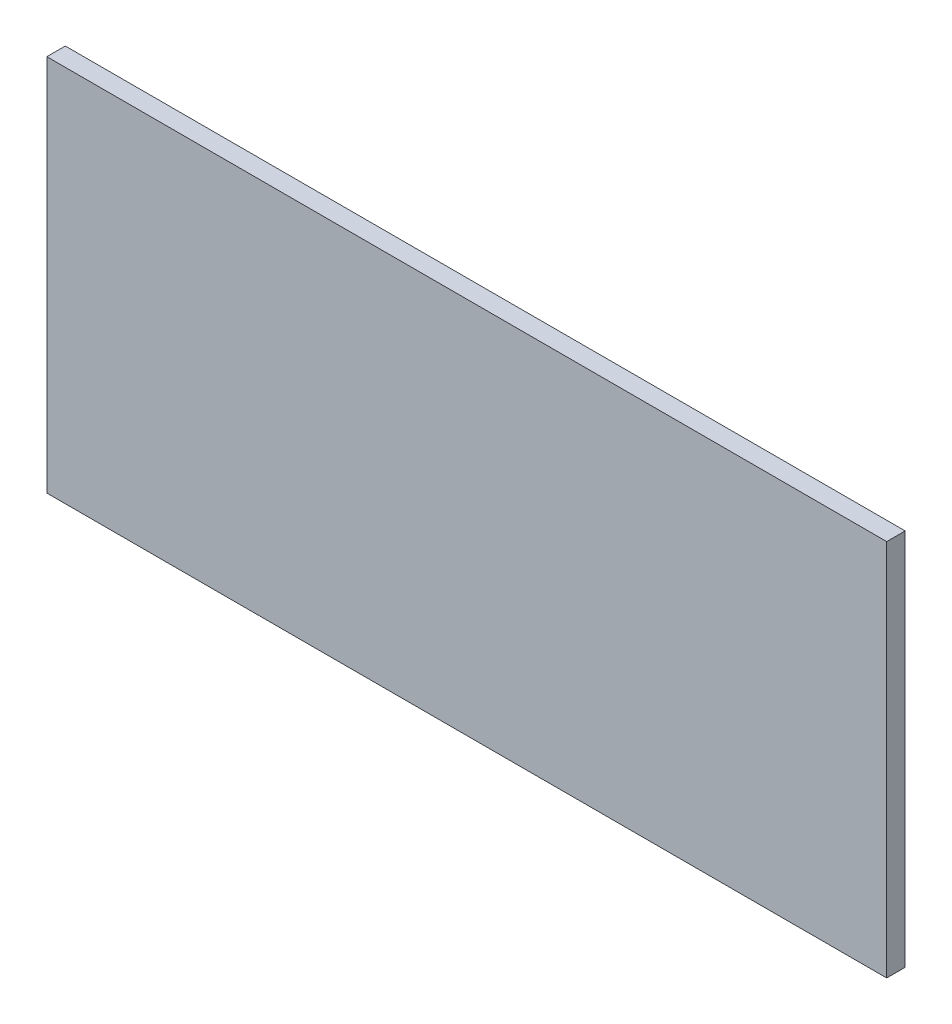
ISO-10303-21;
HEADER;
FILE_DESCRIPTION(('STEP AP214'),'2;1');
FILE_NAME('part.step','',(''),(''),'','','');
FILE_SCHEMA(('AUTOMOTIVE_DESIGN { 1 0 10303 214 1 1 1 1 }'));
ENDSEC;
DATA;
#1=APPLICATION_CONTEXT('core data for automotive mechanical design processes');
#2=APPLICATION_PROTOCOL_DEFINITION('international standard','automotive_design',2000,#1);
#3=PRODUCT_CONTEXT('',#1,'mechanical');
#4=PRODUCT('Part','Part','',(#3));
#5=PRODUCT_RELATED_PRODUCT_CATEGORY('part','',(#4));
#6=PRODUCT_DEFINITION_FORMATION('','',#4);
#7=PRODUCT_DEFINITION_CONTEXT('part definition',#1,'design');
#8=PRODUCT_DEFINITION('design','',#6,#7);
#9=PRODUCT_DEFINITION_SHAPE('','',#8);
#10=(LENGTH_UNIT() NAMED_UNIT(*) SI_UNIT(.MILLI.,.METRE.));
#11=(NAMED_UNIT(*) PLANE_ANGLE_UNIT() SI_UNIT($,.RADIAN.));
#12=(NAMED_UNIT(*) SI_UNIT($,.STERADIAN.) SOLID_ANGLE_UNIT());
#13=UNCERTAINTY_MEASURE_WITH_UNIT(LENGTH_MEASURE(1.E-05),#10,'distance_accuracy_value','');
#14=(GEOMETRIC_REPRESENTATION_CONTEXT(3) GLOBAL_UNCERTAINTY_ASSIGNED_CONTEXT((#13)) GLOBAL_UNIT_ASSIGNED_CONTEXT((#10,
#11,#12)) REPRESENTATION_CONTEXT('',''));
#15=CARTESIAN_POINT('',(0.,0.,0.));
#16=DIRECTION('',(0.,0.,1.));
#17=DIRECTION('',(1.,0.,0.));
#18=AXIS2_PLACEMENT_3D('',#15,#16,#17);
#19=CARTESIAN_POINT('',(47918.0875993109,-20142.6920959454,-5640.));
#20=DIRECTION('',(0.,-1.,0.));
#21=DIRECTION('',(1.,0.,0.));
#22=AXIS2_PLACEMENT_3D('',#19,#20,#21);
#23=PLANE('',#22);
#24=DIRECTION('',(1.,0.,0.));
#25=VECTOR('',#24,1.);
#26=CARTESIAN_POINT('',(47918.0875993109,-20142.6920959454,-3880.));
#27=LINE('',#26,#25);
#28=CARTESIAN_POINT('',(-32081.9124006891,-20142.6920959454,-3880.));
#29=VERTEX_POINT('',#28);
#30=CARTESIAN_POINT('',(47918.0875993109,-20142.6920959454,-3880.));
#31=VERTEX_POINT('',#30);
#32=EDGE_CURVE('E102',#29,#31,#27,.T.);
#33=ORIENTED_EDGE('',*,*,#32,.F.);
#34=DIRECTION('',(0.,0.,1.));
#35=VECTOR('',#34,1.);
#36=CARTESIAN_POINT('',(-32081.9124006891,-20142.6920959454,-5640.));
#37=LINE('',#36,#35);
#38=CARTESIAN_POINT('',(-32081.9124006891,-20142.6920959454,-5640.));
#39=VERTEX_POINT('',#38);
#40=EDGE_CURVE('E11',#39,#29,#37,.T.);
#41=ORIENTED_EDGE('',*,*,#40,.F.);
#42=DIRECTION('',(1.,0.,0.));
#43=VECTOR('',#42,1.);
#44=CARTESIAN_POINT('',(47918.0875993109,-20142.6920959454,-5640.));
#45=LINE('',#44,#43);
#46=CARTESIAN_POINT('',(47918.0875993109,-20142.6920959454,-5640.));
#47=VERTEX_POINT('',#46);
#48=EDGE_CURVE('E95',#39,#47,#45,.T.);
#49=ORIENTED_EDGE('',*,*,#48,.T.);
#50=DIRECTION('',(0.,0.,1.));
#51=VECTOR('',#50,1.);
#52=CARTESIAN_POINT('',(47918.0875993109,-20142.6920959454,-5640.));
#53=LINE('',#52,#51);
#54=EDGE_CURVE('E39',#47,#31,#53,.T.);
#55=ORIENTED_EDGE('',*,*,#54,.T.);
#56=EDGE_LOOP('',(#33,#41,#49,#55));
#57=FACE_BOUND('',#56,.T.);
#58=ADVANCED_FACE('F36',(#57),#23,.T.);
#59=CARTESIAN_POINT('',(-32081.9124006891,15857.3079040546,-5640.));
#60=DIRECTION('',(-1.,0.,0.));
#61=DIRECTION('',(0.,0.,1.));
#62=AXIS2_PLACEMENT_3D('',#59,#60,#61);
#63=PLANE('',#62);
#64=DIRECTION('',(0.,-1.,0.));
#65=VECTOR('',#64,1.);
#66=CARTESIAN_POINT('',(-32081.9124006891,15857.3079040546,-3880.));
#67=LINE('',#66,#65);
#68=CARTESIAN_POINT('',(-32081.9124006891,15857.3079040546,-3880.));
#69=VERTEX_POINT('',#68);
#70=EDGE_CURVE('E98',#69,#29,#67,.T.);
#71=ORIENTED_EDGE('',*,*,#70,.F.);
#72=DIRECTION('',(0.,0.,1.));
#73=VECTOR('',#72,1.);
#74=CARTESIAN_POINT('',(-32081.9124006891,15857.3079040546,-5640.));
#75=LINE('',#74,#73);
#76=CARTESIAN_POINT('',(-32081.9124006891,15857.3079040546,-5640.));
#77=VERTEX_POINT('',#76);
#78=EDGE_CURVE('E45',#77,#69,#75,.T.);
#79=ORIENTED_EDGE('',*,*,#78,.F.);
#80=DIRECTION('',(0.,-1.,0.));
#81=VECTOR('',#80,1.);
#82=CARTESIAN_POINT('',(-32081.9124006891,15857.3079040546,-5640.));
#83=LINE('',#82,#81);
#84=EDGE_CURVE('E91',#77,#39,#83,.T.);
#85=ORIENTED_EDGE('',*,*,#84,.T.);
#86=ORIENTED_EDGE('',*,*,#40,.T.);
#87=EDGE_LOOP('',(#71,#79,#85,#86));
#88=FACE_BOUND('',#87,.T.);
#89=ADVANCED_FACE('F114',(#88),#63,.T.);
#90=CARTESIAN_POINT('',(47918.0875993109,15857.3079040546,-5640.));
#91=DIRECTION('',(0.,1.,0.));
#92=DIRECTION('',(0.,0.,1.));
#93=AXIS2_PLACEMENT_3D('',#90,#91,#92);
#94=PLANE('',#93);
#95=DIRECTION('',(-1.,0.,0.));
#96=VECTOR('',#95,1.);
#97=CARTESIAN_POINT('',(47918.0875993109,15857.3079040546,-3880.));
#98=LINE('',#97,#96);
#99=CARTESIAN_POINT('',(47918.0875993109,15857.3079040546,-3880.));
#100=VERTEX_POINT('',#99);
#101=EDGE_CURVE('E86',#100,#69,#98,.T.);
#102=ORIENTED_EDGE('',*,*,#101,.F.);
#103=DIRECTION('',(0.,0.,1.));
#104=VECTOR('',#103,1.);
#105=CARTESIAN_POINT('',(47918.0875993109,15857.3079040546,-5640.));
#106=LINE('',#105,#104);
#107=CARTESIAN_POINT('',(47918.0875993109,15857.3079040546,-5640.));
#108=VERTEX_POINT('',#107);
#109=EDGE_CURVE('E81',#108,#100,#106,.T.);
#110=ORIENTED_EDGE('',*,*,#109,.F.);
#111=DIRECTION('',(-1.,0.,0.));
#112=VECTOR('',#111,1.);
#113=CARTESIAN_POINT('',(47918.0875993109,15857.3079040546,-5640.));
#114=LINE('',#113,#112);
#115=EDGE_CURVE('E84',#108,#77,#114,.T.);
#116=ORIENTED_EDGE('',*,*,#115,.T.);
#117=ORIENTED_EDGE('',*,*,#78,.T.);
#118=EDGE_LOOP('',(#102,#110,#116,#117));
#119=FACE_BOUND('',#118,.T.);
#120=ADVANCED_FACE('F83',(#119),#94,.T.);
#121=CARTESIAN_POINT('',(47918.0875993109,15857.3079040546,-5640.));
#122=DIRECTION('',(1.,0.,0.));
#123=DIRECTION('',(0.,1.,0.));
#124=AXIS2_PLACEMENT_3D('',#121,#122,#123);
#125=PLANE('',#124);
#126=DIRECTION('',(0.,1.,0.));
#127=VECTOR('',#126,1.);
#128=CARTESIAN_POINT('',(47918.0875993109,15857.3079040546,-3880.));
#129=LINE('',#128,#127);
#130=EDGE_CURVE('E106',#31,#100,#129,.T.);
#131=ORIENTED_EDGE('',*,*,#130,.F.);
#132=ORIENTED_EDGE('',*,*,#54,.F.);
#133=DIRECTION('',(0.,1.,0.));
#134=VECTOR('',#133,1.);
#135=CARTESIAN_POINT('',(47918.0875993109,15857.3079040546,-5640.));
#136=LINE('',#135,#134);
#137=EDGE_CURVE('E90',#47,#108,#136,.T.);
#138=ORIENTED_EDGE('',*,*,#137,.T.);
#139=ORIENTED_EDGE('',*,*,#109,.T.);
#140=EDGE_LOOP('',(#131,#132,#138,#139));
#141=FACE_BOUND('',#140,.T.);
#142=ADVANCED_FACE('F94',(#141),#125,.T.);
#143=CARTESIAN_POINT('',(0.,0.,-5640.));
#144=DIRECTION('',(0.,0.,1.));
#145=DIRECTION('',(1.,0.,0.));
#146=AXIS2_PLACEMENT_3D('',#143,#144,#145);
#147=PLANE('',#146);
#148=ORIENTED_EDGE('',*,*,#48,.F.);
#149=ORIENTED_EDGE('',*,*,#84,.F.);
#150=ORIENTED_EDGE('',*,*,#115,.F.);
#151=ORIENTED_EDGE('',*,*,#137,.F.);
#152=EDGE_LOOP('',(#148,#149,#150,#151));
#153=FACE_BOUND('',#152,.T.);
#154=ADVANCED_FACE('F89',(#153),#147,.F.);
#155=CARTESIAN_POINT('',(0.,0.,-3880.));
#156=DIRECTION('',(0.,0.,1.));
#157=DIRECTION('',(1.,0.,0.));
#158=AXIS2_PLACEMENT_3D('',#155,#156,#157);
#159=PLANE('',#158);
#160=ORIENTED_EDGE('',*,*,#32,.T.);
#161=ORIENTED_EDGE('',*,*,#130,.T.);
#162=ORIENTED_EDGE('',*,*,#101,.T.);
#163=ORIENTED_EDGE('',*,*,#70,.T.);
#164=EDGE_LOOP('',(#160,#161,#162,#163));
#165=FACE_BOUND('',#164,.T.);
#166=ADVANCED_FACE('F113',(#165),#159,.T.);
#167=CLOSED_SHELL('',(#58,#89,#120,#142,#154,#166));
#168=MANIFOLD_SOLID_BREP('B2',#167);
#169=ADVANCED_BREP_SHAPE_REPRESENTATION('',(#18,#168),#14);
#170=SHAPE_DEFINITION_REPRESENTATION(#9,#169);
ENDSEC;
END-ISO-10303-21;
